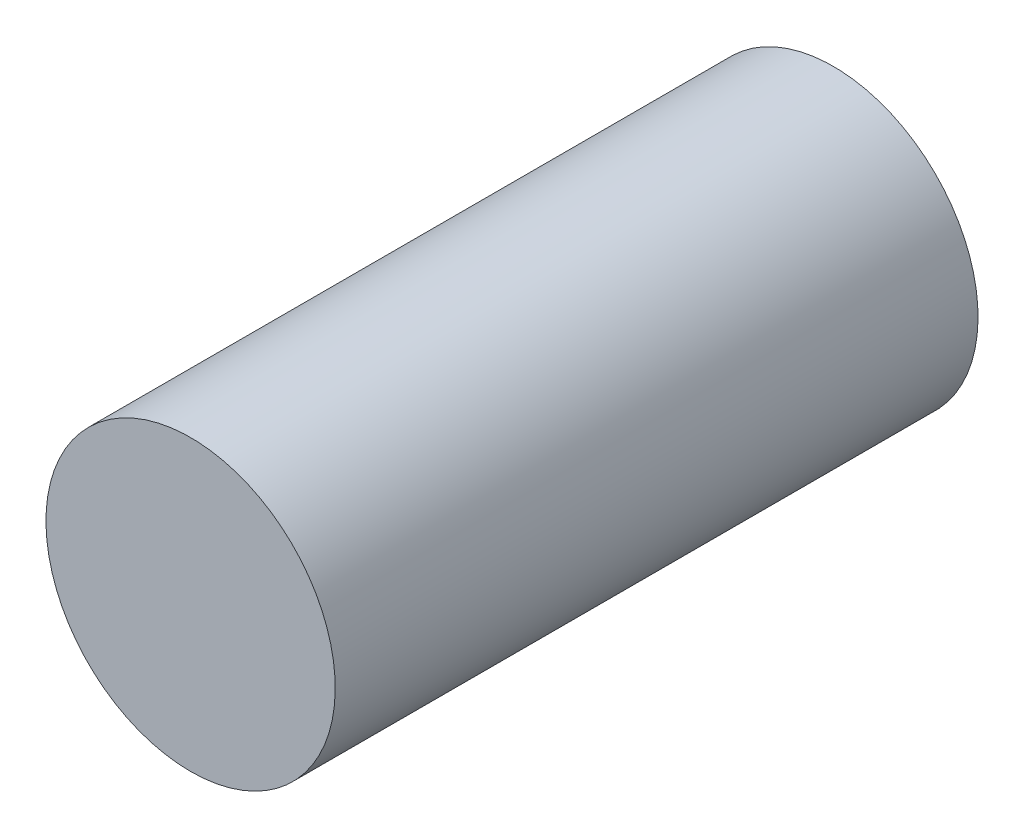
ISO-10303-21;
HEADER;
FILE_DESCRIPTION(('STEP AP214'),'2;1');
FILE_NAME('part.step','',(''),(''),'','','');
FILE_SCHEMA(('AUTOMOTIVE_DESIGN { 1 0 10303 214 1 1 1 1 }'));
ENDSEC;
DATA;
#1=APPLICATION_CONTEXT('core data for automotive mechanical design processes');
#2=APPLICATION_PROTOCOL_DEFINITION('international standard','automotive_design',2000,#1);
#3=PRODUCT_CONTEXT('',#1,'mechanical');
#4=PRODUCT('Part','Part','',(#3));
#5=PRODUCT_RELATED_PRODUCT_CATEGORY('part','',(#4));
#6=PRODUCT_DEFINITION_FORMATION('','',#4);
#7=PRODUCT_DEFINITION_CONTEXT('part definition',#1,'design');
#8=PRODUCT_DEFINITION('design','',#6,#7);
#9=PRODUCT_DEFINITION_SHAPE('','',#8);
#10=(LENGTH_UNIT() NAMED_UNIT(*) SI_UNIT(.MILLI.,.METRE.));
#11=(NAMED_UNIT(*) PLANE_ANGLE_UNIT() SI_UNIT($,.RADIAN.));
#12=(NAMED_UNIT(*) SI_UNIT($,.STERADIAN.) SOLID_ANGLE_UNIT());
#13=UNCERTAINTY_MEASURE_WITH_UNIT(LENGTH_MEASURE(1.E-05),#10,'distance_accuracy_value','');
#14=(GEOMETRIC_REPRESENTATION_CONTEXT(3) GLOBAL_UNCERTAINTY_ASSIGNED_CONTEXT((#13)) GLOBAL_UNIT_ASSIGNED_CONTEXT((#10,
#11,#12)) REPRESENTATION_CONTEXT('',''));
#15=CARTESIAN_POINT('',(0.,0.,0.));
#16=DIRECTION('',(0.,0.,1.));
#17=DIRECTION('',(1.,0.,0.));
#18=AXIS2_PLACEMENT_3D('',#15,#16,#17);
#19=CARTESIAN_POINT('',(1.8013,1.8013,8.0013));
#20=DIRECTION('',(0.,0.,1.));
#21=DIRECTION('',(0.,-1.,0.));
#22=AXIS2_PLACEMENT_3D('',#19,#20,#21);
#23=PLANE('',#22);
#24=CARTESIAN_POINT('',(1.8013,1.8013,8.0013));
#25=DIRECTION('',(0.,0.,1.));
#26=DIRECTION('',(0.,-1.,0.));
#27=AXIS2_PLACEMENT_3D('',#24,#25,#26);
#28=CIRCLE('',#27,1.8);
#29=CARTESIAN_POINT('',(1.8013,0.00130000000000074,8.0013));
#30=VERTEX_POINT('',#29);
#31=EDGE_CURVE('E16',#30,#30,#28,.F.);
#32=ORIENTED_EDGE('',*,*,#31,.F.);
#33=EDGE_LOOP('',(#32));
#34=FACE_BOUND('',#33,.T.);
#35=ADVANCED_FACE('F13',(#34),#23,.T.);
#36=CARTESIAN_POINT('',(1.8013,1.8013,0.001300000000015));
#37=DIRECTION('',(0.,0.,1.));
#38=DIRECTION('',(0.,-1.,0.));
#39=AXIS2_PLACEMENT_3D('',#36,#37,#38);
#40=PLANE('',#39);
#41=CARTESIAN_POINT('',(1.8013,1.8013,0.001300000000015));
#42=DIRECTION('',(0.,0.,1.));
#43=DIRECTION('',(0.,-1.,0.));
#44=AXIS2_PLACEMENT_3D('',#41,#42,#43);
#45=CIRCLE('',#44,1.8);
#46=CARTESIAN_POINT('',(1.8013,0.00129999999999987,0.0013000000000152));
#47=VERTEX_POINT('',#46);
#48=EDGE_CURVE('E8',#47,#47,#45,.T.);
#49=ORIENTED_EDGE('',*,*,#48,.F.);
#50=EDGE_LOOP('',(#49));
#51=FACE_BOUND('',#50,.T.);
#52=ADVANCED_FACE('F28',(#51),#40,.F.);
#53=CARTESIAN_POINT('',(1.8013,1.8013,0.001300000000015));
#54=DIRECTION('',(0.,0.,1.));
#55=DIRECTION('',(0.,-1.,0.));
#56=AXIS2_PLACEMENT_3D('',#53,#54,#55);
#57=CYLINDRICAL_SURFACE('',#56,1.8);
#58=ORIENTED_EDGE('',*,*,#48,.T.);
#59=EDGE_LOOP('',(#58));
#60=FACE_BOUND('',#59,.T.);
#61=ORIENTED_EDGE('',*,*,#31,.T.);
#62=EDGE_LOOP('',(#61));
#63=FACE_BOUND('',#62,.T.);
#64=ADVANCED_FACE('F25',(#60,#63),#57,.T.);
#65=CLOSED_SHELL('',(#35,#52,#64));
#66=MANIFOLD_SOLID_BREP('B1',#65);
#67=ADVANCED_BREP_SHAPE_REPRESENTATION('',(#18,#66),#14);
#68=SHAPE_DEFINITION_REPRESENTATION(#9,#67);
ENDSEC;
END-ISO-10303-21;
